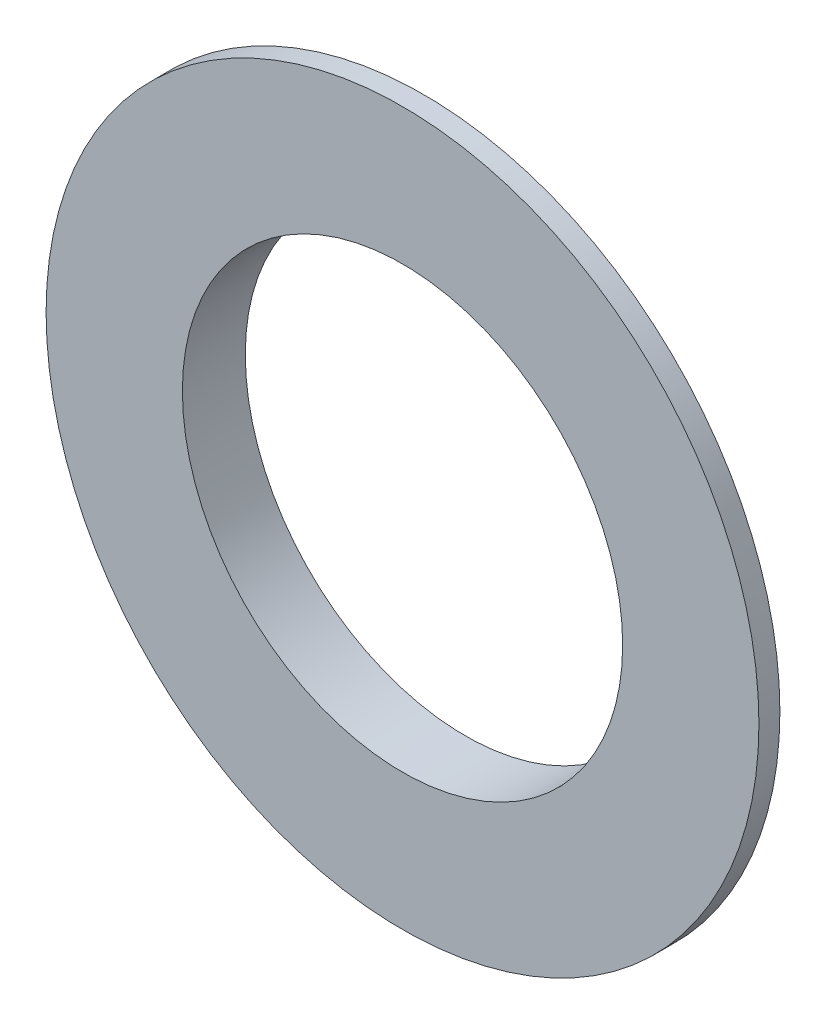
ISO-10303-21;
HEADER;
FILE_DESCRIPTION(('STEP AP214'),'2;1');
FILE_NAME('part.step','',(''),(''),'','','');
FILE_SCHEMA(('AUTOMOTIVE_DESIGN { 1 0 10303 214 1 1 1 1 }'));
ENDSEC;
DATA;
#1=APPLICATION_CONTEXT('core data for automotive mechanical design processes');
#2=APPLICATION_PROTOCOL_DEFINITION('international standard','automotive_design',2000,#1);
#3=PRODUCT_CONTEXT('',#1,'mechanical');
#4=PRODUCT('Part','Part','',(#3));
#5=PRODUCT_RELATED_PRODUCT_CATEGORY('part','',(#4));
#6=PRODUCT_DEFINITION_FORMATION('','',#4);
#7=PRODUCT_DEFINITION_CONTEXT('part definition',#1,'design');
#8=PRODUCT_DEFINITION('design','',#6,#7);
#9=PRODUCT_DEFINITION_SHAPE('','',#8);
#10=(LENGTH_UNIT() NAMED_UNIT(*) SI_UNIT(.MILLI.,.METRE.));
#11=(NAMED_UNIT(*) PLANE_ANGLE_UNIT() SI_UNIT($,.RADIAN.));
#12=(NAMED_UNIT(*) SI_UNIT($,.STERADIAN.) SOLID_ANGLE_UNIT());
#13=UNCERTAINTY_MEASURE_WITH_UNIT(LENGTH_MEASURE(1.E-05),#10,'distance_accuracy_value','');
#14=(GEOMETRIC_REPRESENTATION_CONTEXT(3) GLOBAL_UNCERTAINTY_ASSIGNED_CONTEXT((#13)) GLOBAL_UNIT_ASSIGNED_CONTEXT((#10,
#11,#12)) REPRESENTATION_CONTEXT('',''));
#15=CARTESIAN_POINT('',(0.,0.,0.));
#16=DIRECTION('',(0.,0.,1.));
#17=DIRECTION('',(1.,0.,0.));
#18=AXIS2_PLACEMENT_3D('',#15,#16,#17);
#19=CARTESIAN_POINT('',(17.,0.,0.));
#20=DIRECTION('',(0.,0.,1.));
#21=DIRECTION('',(1.,0.,0.));
#22=AXIS2_PLACEMENT_3D('',#19,#20,#21);
#23=PLANE('',#22);
#24=CARTESIAN_POINT('',(0.,0.,0.));
#25=DIRECTION('',(0.,0.,1.));
#26=DIRECTION('',(1.,0.,0.));
#27=AXIS2_PLACEMENT_3D('',#24,#25,#26);
#28=CIRCLE('',#27,17.);
#29=CARTESIAN_POINT('',(17.,0.,0.));
#30=VERTEX_POINT('',#29);
#31=EDGE_CURVE('E55',#30,#30,#28,.T.);
#32=ORIENTED_EDGE('',*,*,#31,.T.);
#33=EDGE_LOOP('',(#32));
#34=FACE_BOUND('',#33,.T.);
#35=CARTESIAN_POINT('',(0.,0.,0.));
#36=DIRECTION('',(0.,0.,1.));
#37=DIRECTION('',(1.,0.,0.));
#38=AXIS2_PLACEMENT_3D('',#35,#36,#37);
#39=CIRCLE('',#38,10.5);
#40=CARTESIAN_POINT('',(10.5,0.,0.));
#41=VERTEX_POINT('',#40);
#42=EDGE_CURVE('E10',#41,#41,#39,.T.);
#43=ORIENTED_EDGE('',*,*,#42,.F.);
#44=EDGE_LOOP('',(#43));
#45=FACE_BOUND('',#44,.T.);
#46=ADVANCED_FACE('F41',(#34,#45),#23,.T.);
#47=CARTESIAN_POINT('',(0.,0.,0.));
#48=DIRECTION('',(0.,0.,1.));
#49=DIRECTION('',(1.,0.,0.));
#50=AXIS2_PLACEMENT_3D('',#47,#48,#49);
#51=CYLINDRICAL_SURFACE('',#50,10.5);
#52=ORIENTED_EDGE('',*,*,#42,.T.);
#53=EDGE_LOOP('',(#52));
#54=FACE_BOUND('',#53,.T.);
#55=CARTESIAN_POINT('',(0.,0.,-3.));
#56=DIRECTION('',(0.,0.,1.));
#57=DIRECTION('',(1.,0.,0.));
#58=AXIS2_PLACEMENT_3D('',#55,#56,#57);
#59=CIRCLE('',#58,10.5);
#60=CARTESIAN_POINT('',(10.5,0.,-3.));
#61=VERTEX_POINT('',#60);
#62=EDGE_CURVE('E47',#61,#61,#59,.T.);
#63=ORIENTED_EDGE('',*,*,#62,.F.);
#64=EDGE_LOOP('',(#63));
#65=FACE_BOUND('',#64,.T.);
#66=ADVANCED_FACE('F71',(#54,#65),#51,.F.);
#67=CARTESIAN_POINT('',(0.,0.,-1.));
#68=DIRECTION('',(0.,0.,1.));
#69=DIRECTION('',(1.,0.,0.));
#70=AXIS2_PLACEMENT_3D('',#67,#68,#69);
#71=CONICAL_SURFACE('',#70,17.,1.27229739520872);
#72=ORIENTED_EDGE('',*,*,#62,.T.);
#73=EDGE_LOOP('',(#72));
#74=FACE_BOUND('',#73,.T.);
#75=CARTESIAN_POINT('',(0.,0.,-1.));
#76=DIRECTION('',(0.,0.,1.));
#77=DIRECTION('',(1.,0.,0.));
#78=AXIS2_PLACEMENT_3D('',#75,#76,#77);
#79=CIRCLE('',#78,17.);
#80=CARTESIAN_POINT('',(17.,0.,-1.));
#81=VERTEX_POINT('',#80);
#82=EDGE_CURVE('E51',#81,#81,#79,.T.);
#83=ORIENTED_EDGE('',*,*,#82,.F.);
#84=EDGE_LOOP('',(#83));
#85=FACE_BOUND('',#84,.T.);
#86=ADVANCED_FACE('F65',(#74,#85),#71,.T.);
#87=CARTESIAN_POINT('',(0.,0.,0.));
#88=DIRECTION('',(0.,0.,1.));
#89=DIRECTION('',(1.,0.,0.));
#90=AXIS2_PLACEMENT_3D('',#87,#88,#89);
#91=CYLINDRICAL_SURFACE('',#90,17.);
#92=ORIENTED_EDGE('',*,*,#82,.T.);
#93=EDGE_LOOP('',(#92));
#94=FACE_BOUND('',#93,.T.);
#95=ORIENTED_EDGE('',*,*,#31,.F.);
#96=EDGE_LOOP('',(#95));
#97=FACE_BOUND('',#96,.T.);
#98=ADVANCED_FACE('F63',(#94,#97),#91,.T.);
#99=CLOSED_SHELL('',(#46,#66,#86,#98));
#100=MANIFOLD_SOLID_BREP('B2',#99);
#101=ADVANCED_BREP_SHAPE_REPRESENTATION('',(#18,#100),#14);
#102=SHAPE_DEFINITION_REPRESENTATION(#9,#101);
ENDSEC;
END-ISO-10303-21;
